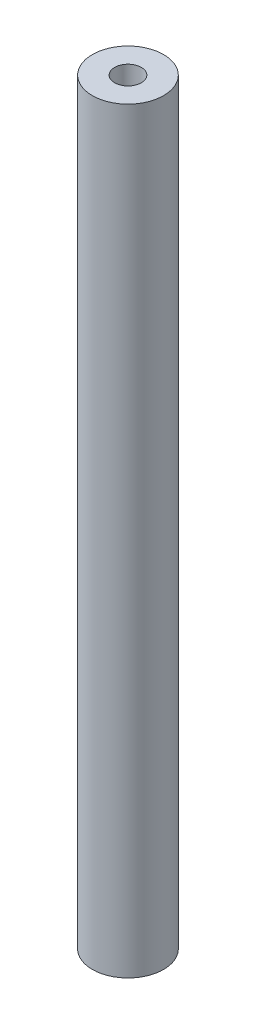
ISO-10303-21;
HEADER;
FILE_DESCRIPTION(('STEP AP214'),'2;1');
FILE_NAME('part.step','',(''),(''),'','','');
FILE_SCHEMA(('AUTOMOTIVE_DESIGN { 1 0 10303 214 1 1 1 1 }'));
ENDSEC;
DATA;
#1=APPLICATION_CONTEXT('core data for automotive mechanical design processes');
#2=APPLICATION_PROTOCOL_DEFINITION('international standard','automotive_design',2000,#1);
#3=PRODUCT_CONTEXT('',#1,'mechanical');
#4=PRODUCT('Part','Part','',(#3));
#5=PRODUCT_RELATED_PRODUCT_CATEGORY('part','',(#4));
#6=PRODUCT_DEFINITION_FORMATION('','',#4);
#7=PRODUCT_DEFINITION_CONTEXT('part definition',#1,'design');
#8=PRODUCT_DEFINITION('design','',#6,#7);
#9=PRODUCT_DEFINITION_SHAPE('','',#8);
#10=(LENGTH_UNIT() NAMED_UNIT(*) SI_UNIT(.MILLI.,.METRE.));
#11=(NAMED_UNIT(*) PLANE_ANGLE_UNIT() SI_UNIT($,.RADIAN.));
#12=(NAMED_UNIT(*) SI_UNIT($,.STERADIAN.) SOLID_ANGLE_UNIT());
#13=UNCERTAINTY_MEASURE_WITH_UNIT(LENGTH_MEASURE(1.E-05),#10,'distance_accuracy_value','');
#14=(GEOMETRIC_REPRESENTATION_CONTEXT(3) GLOBAL_UNCERTAINTY_ASSIGNED_CONTEXT((#13)) GLOBAL_UNIT_ASSIGNED_CONTEXT((#10,
#11,#12)) REPRESENTATION_CONTEXT('',''));
#15=CARTESIAN_POINT('',(0.,0.,0.));
#16=DIRECTION('',(0.,0.,1.));
#17=DIRECTION('',(1.,0.,0.));
#18=AXIS2_PLACEMENT_3D('',#15,#16,#17);
#19=CARTESIAN_POINT('',(0.,85.,0.));
#20=DIRECTION('',(0.,1.,0.));
#21=DIRECTION('',(0.,0.,1.));
#22=AXIS2_PLACEMENT_3D('',#19,#20,#21);
#23=PLANE('',#22);
#24=CARTESIAN_POINT('',(0.,85.,0.));
#25=DIRECTION('',(0.,1.,0.));
#26=DIRECTION('',(0.,0.,1.));
#27=AXIS2_PLACEMENT_3D('',#24,#25,#26);
#28=CIRCLE('',#27,4.);
#29=CARTESIAN_POINT('',(0.,85.,4.));
#30=VERTEX_POINT('',#29);
#31=EDGE_CURVE('E10',#30,#30,#28,.T.);
#32=ORIENTED_EDGE('',*,*,#31,.T.);
#33=EDGE_LOOP('',(#32));
#34=FACE_BOUND('',#33,.T.);
#35=CARTESIAN_POINT('',(0.,85.,0.));
#36=DIRECTION('',(0.,1.,0.));
#37=DIRECTION('',(0.,0.,1.));
#38=AXIS2_PLACEMENT_3D('',#35,#36,#37);
#39=CIRCLE('',#38,1.5);
#40=CARTESIAN_POINT('',(0.,85.,1.5));
#41=VERTEX_POINT('',#40);
#42=EDGE_CURVE('E46',#41,#41,#39,.T.);
#43=ORIENTED_EDGE('',*,*,#42,.F.);
#44=EDGE_LOOP('',(#43));
#45=FACE_BOUND('',#44,.T.);
#46=ADVANCED_FACE('F35',(#34,#45),#23,.T.);
#47=CARTESIAN_POINT('',(0.,0.,0.));
#48=DIRECTION('',(0.,1.,0.));
#49=DIRECTION('',(0.,0.,1.));
#50=AXIS2_PLACEMENT_3D('',#47,#48,#49);
#51=PLANE('',#50);
#52=CARTESIAN_POINT('',(0.,0.,0.));
#53=DIRECTION('',(0.,1.,0.));
#54=DIRECTION('',(0.,0.,1.));
#55=AXIS2_PLACEMENT_3D('',#52,#53,#54);
#56=CIRCLE('',#55,4.);
#57=CARTESIAN_POINT('',(0.,0.,4.));
#58=VERTEX_POINT('',#57);
#59=EDGE_CURVE('E39',#58,#58,#56,.T.);
#60=ORIENTED_EDGE('',*,*,#59,.F.);
#61=EDGE_LOOP('',(#60));
#62=FACE_BOUND('',#61,.T.);
#63=CARTESIAN_POINT('',(0.,0.,0.));
#64=DIRECTION('',(0.,1.,0.));
#65=DIRECTION('',(0.,0.,1.));
#66=AXIS2_PLACEMENT_3D('',#63,#64,#65);
#67=CIRCLE('',#66,1.5);
#68=CARTESIAN_POINT('',(0.,0.,1.5));
#69=VERTEX_POINT('',#68);
#70=EDGE_CURVE('E48',#69,#69,#67,.T.);
#71=ORIENTED_EDGE('',*,*,#70,.T.);
#72=EDGE_LOOP('',(#71));
#73=FACE_BOUND('',#72,.T.);
#74=ADVANCED_FACE('F58',(#62,#73),#51,.F.);
#75=CARTESIAN_POINT('',(0.,85.,0.));
#76=DIRECTION('',(0.,-1.,0.));
#77=DIRECTION('',(0.,0.,-1.));
#78=AXIS2_PLACEMENT_3D('',#75,#76,#77);
#79=CYLINDRICAL_SURFACE('',#78,4.);
#80=ORIENTED_EDGE('',*,*,#31,.F.);
#81=EDGE_LOOP('',(#80));
#82=FACE_BOUND('',#81,.T.);
#83=ORIENTED_EDGE('',*,*,#59,.T.);
#84=EDGE_LOOP('',(#83));
#85=FACE_BOUND('',#84,.T.);
#86=ADVANCED_FACE('F37',(#82,#85),#79,.T.);
#87=CARTESIAN_POINT('',(0.,85.,0.));
#88=DIRECTION('',(0.,-1.,0.));
#89=DIRECTION('',(0.,0.,-1.));
#90=AXIS2_PLACEMENT_3D('',#87,#88,#89);
#91=CYLINDRICAL_SURFACE('',#90,1.5);
#92=ORIENTED_EDGE('',*,*,#42,.T.);
#93=EDGE_LOOP('',(#92));
#94=FACE_BOUND('',#93,.T.);
#95=ORIENTED_EDGE('',*,*,#70,.F.);
#96=EDGE_LOOP('',(#95));
#97=FACE_BOUND('',#96,.T.);
#98=ADVANCED_FACE('F54',(#94,#97),#91,.F.);
#99=CLOSED_SHELL('',(#46,#74,#86,#98));
#100=MANIFOLD_SOLID_BREP('B2',#99);
#101=ADVANCED_BREP_SHAPE_REPRESENTATION('',(#18,#100),#14);
#102=SHAPE_DEFINITION_REPRESENTATION(#9,#101);
ENDSEC;
END-ISO-10303-21;
